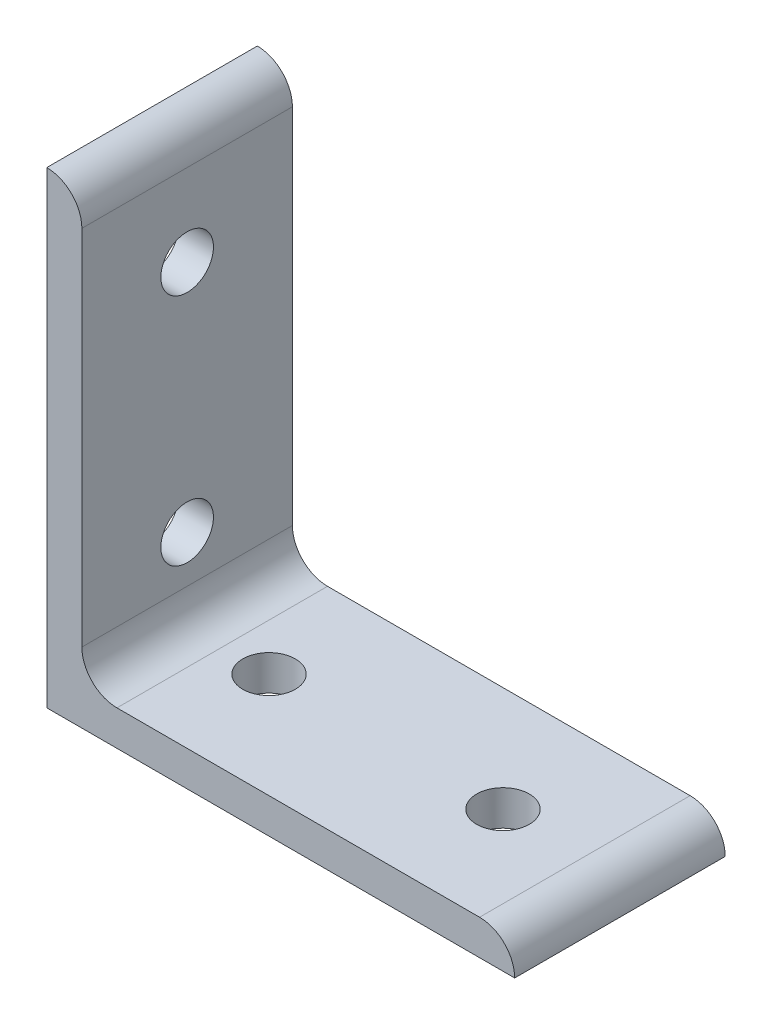
ISO-10303-21;
HEADER;
FILE_DESCRIPTION(('STEP AP214'),'2;1');
FILE_NAME('part.step','',(''),(''),'','','');
FILE_SCHEMA(('AUTOMOTIVE_DESIGN { 1 0 10303 214 1 1 1 1 }'));
ENDSEC;
DATA;
#1=APPLICATION_CONTEXT('core data for automotive mechanical design processes');
#2=APPLICATION_PROTOCOL_DEFINITION('international standard','automotive_design',2000,#1);
#3=PRODUCT_CONTEXT('',#1,'mechanical');
#4=PRODUCT('Part','Part','',(#3));
#5=PRODUCT_RELATED_PRODUCT_CATEGORY('part','',(#4));
#6=PRODUCT_DEFINITION_FORMATION('','',#4);
#7=PRODUCT_DEFINITION_CONTEXT('part definition',#1,'design');
#8=PRODUCT_DEFINITION('design','',#6,#7);
#9=PRODUCT_DEFINITION_SHAPE('','',#8);
#10=(LENGTH_UNIT() NAMED_UNIT(*) SI_UNIT(.MILLI.,.METRE.));
#11=(NAMED_UNIT(*) PLANE_ANGLE_UNIT() SI_UNIT($,.RADIAN.));
#12=(NAMED_UNIT(*) SI_UNIT($,.STERADIAN.) SOLID_ANGLE_UNIT());
#13=UNCERTAINTY_MEASURE_WITH_UNIT(LENGTH_MEASURE(1.E-05),#10,'distance_accuracy_value','');
#14=(GEOMETRIC_REPRESENTATION_CONTEXT(3) GLOBAL_UNCERTAINTY_ASSIGNED_CONTEXT((#13)) GLOBAL_UNIT_ASSIGNED_CONTEXT((#10,
#11,#12)) REPRESENTATION_CONTEXT('',''));
#15=CARTESIAN_POINT('',(0.,0.,0.));
#16=DIRECTION('',(0.,0.,1.));
#17=DIRECTION('',(1.,0.,0.));
#18=AXIS2_PLACEMENT_3D('',#15,#16,#17);
#19=CARTESIAN_POINT('',(5.99999999999999,74.,18.));
#20=DIRECTION('',(-1.,0.,0.));
#21=DIRECTION('',(0.,-1.,0.));
#22=AXIS2_PLACEMENT_3D('',#19,#20,#21);
#23=PLANE('',#22);
#24=CARTESIAN_POINT('',(6.00000000000001,20.,0.));
#25=DIRECTION('',(-1.,0.,0.));
#26=DIRECTION('',(0.,-1.,0.));
#27=AXIS2_PLACEMENT_3D('',#24,#25,#26);
#28=CIRCLE('',#27,4.5);
#29=CARTESIAN_POINT('',(6.00000000000001,15.5,0.));
#30=VERTEX_POINT('',#29);
#31=EDGE_CURVE('E199',#30,#30,#28,.F.);
#32=ORIENTED_EDGE('',*,*,#31,.F.);
#33=EDGE_LOOP('',(#32));
#34=FACE_BOUND('',#33,.T.);
#35=DIRECTION('',(0.,1.,0.));
#36=VECTOR('',#35,1.);
#37=CARTESIAN_POINT('',(5.99999999999999,74.,-18.));
#38=LINE('',#37,#36);
#39=CARTESIAN_POINT('',(6.,12.,-18.));
#40=VERTEX_POINT('',#39);
#41=CARTESIAN_POINT('',(6.00000000000001,74.,-18.));
#42=VERTEX_POINT('',#41);
#43=EDGE_CURVE('E120',#40,#42,#38,.T.);
#44=ORIENTED_EDGE('',*,*,#43,.T.);
#45=DIRECTION('',(0.,0.,-1.));
#46=VECTOR('',#45,1.);
#47=CARTESIAN_POINT('',(6.00000000000001,74.,18.));
#48=LINE('',#47,#46);
#49=CARTESIAN_POINT('',(6.00000000000001,74.,18.));
#50=VERTEX_POINT('',#49);
#51=EDGE_CURVE('E117',#50,#42,#48,.T.);
#52=ORIENTED_EDGE('',*,*,#51,.F.);
#53=DIRECTION('',(0.,1.,0.));
#54=VECTOR('',#53,1.);
#55=CARTESIAN_POINT('',(5.99999999999999,74.,18.));
#56=LINE('',#55,#54);
#57=CARTESIAN_POINT('',(6.,12.,18.));
#58=VERTEX_POINT('',#57);
#59=EDGE_CURVE('E106',#58,#50,#56,.T.);
#60=ORIENTED_EDGE('',*,*,#59,.F.);
#61=DIRECTION('',(0.,0.,-1.));
#62=VECTOR('',#61,1.);
#63=CARTESIAN_POINT('',(6.,12.,18.));
#64=LINE('',#63,#62);
#65=EDGE_CURVE('E121',#58,#40,#64,.T.);
#66=ORIENTED_EDGE('',*,*,#65,.T.);
#67=EDGE_LOOP('',(#44,#52,#60,#66));
#68=FACE_BOUND('',#67,.T.);
#69=CARTESIAN_POINT('',(5.99999999999999,60.,0.));
#70=DIRECTION('',(-1.,0.,0.));
#71=DIRECTION('',(0.,-1.,0.));
#72=AXIS2_PLACEMENT_3D('',#69,#70,#71);
#73=CIRCLE('',#72,4.5);
#74=CARTESIAN_POINT('',(5.99999999999999,55.5,0.));
#75=VERTEX_POINT('',#74);
#76=EDGE_CURVE('E192',#75,#75,#73,.F.);
#77=ORIENTED_EDGE('',*,*,#76,.F.);
#78=EDGE_LOOP('',(#77));
#79=FACE_BOUND('',#78,.T.);
#80=ADVANCED_FACE('F37',(#34,#68,#79),#23,.F.);
#81=CARTESIAN_POINT('',(0.,0.,18.));
#82=DIRECTION('',(1.,0.,0.));
#83=DIRECTION('',(0.,0.,-1.));
#84=AXIS2_PLACEMENT_3D('',#81,#82,#83);
#85=PLANE('',#84);
#86=CARTESIAN_POINT('',(0.,20.,0.));
#87=DIRECTION('',(1.,0.,0.));
#88=DIRECTION('',(0.,0.,-1.));
#89=AXIS2_PLACEMENT_3D('',#86,#87,#88);
#90=CIRCLE('',#89,4.5);
#91=CARTESIAN_POINT('',(0.,20.,-4.5));
#92=VERTEX_POINT('',#91);
#93=EDGE_CURVE('E195',#92,#92,#90,.T.);
#94=ORIENTED_EDGE('',*,*,#93,.T.);
#95=EDGE_LOOP('',(#94));
#96=FACE_BOUND('',#95,.T.);
#97=DIRECTION('',(0.,-1.,0.));
#98=VECTOR('',#97,1.);
#99=CARTESIAN_POINT('',(0.,0.,-18.));
#100=LINE('',#99,#98);
#101=CARTESIAN_POINT('',(0.,80.,-18.));
#102=VERTEX_POINT('',#101);
#103=CARTESIAN_POINT('',(0.,0.,-18.));
#104=VERTEX_POINT('',#103);
#105=EDGE_CURVE('E88',#102,#104,#100,.T.);
#106=ORIENTED_EDGE('',*,*,#105,.T.);
#107=DIRECTION('',(0.,0.,-1.));
#108=VECTOR('',#107,1.);
#109=CARTESIAN_POINT('',(0.,0.,18.));
#110=LINE('',#109,#108);
#111=CARTESIAN_POINT('',(0.,0.,18.));
#112=VERTEX_POINT('',#111);
#113=EDGE_CURVE('E126',#112,#104,#110,.T.);
#114=ORIENTED_EDGE('',*,*,#113,.F.);
#115=DIRECTION('',(0.,-1.,0.));
#116=VECTOR('',#115,1.);
#117=CARTESIAN_POINT('',(0.,0.,18.));
#118=LINE('',#117,#116);
#119=CARTESIAN_POINT('',(0.,80.,18.));
#120=VERTEX_POINT('',#119);
#121=EDGE_CURVE('E56',#120,#112,#118,.T.);
#122=ORIENTED_EDGE('',*,*,#121,.F.);
#123=DIRECTION('',(0.,0.,-1.));
#124=VECTOR('',#123,1.);
#125=CARTESIAN_POINT('',(0.,80.,18.));
#126=LINE('',#125,#124);
#127=EDGE_CURVE('E122',#120,#102,#126,.T.);
#128=ORIENTED_EDGE('',*,*,#127,.T.);
#129=EDGE_LOOP('',(#106,#114,#122,#128));
#130=FACE_BOUND('',#129,.T.);
#131=CARTESIAN_POINT('',(0.,60.,0.));
#132=DIRECTION('',(1.,0.,0.));
#133=DIRECTION('',(0.,0.,-1.));
#134=AXIS2_PLACEMENT_3D('',#131,#132,#133);
#135=CIRCLE('',#134,4.5);
#136=CARTESIAN_POINT('',(0.,60.,-4.5));
#137=VERTEX_POINT('',#136);
#138=EDGE_CURVE('E190',#137,#137,#135,.T.);
#139=ORIENTED_EDGE('',*,*,#138,.T.);
#140=EDGE_LOOP('',(#139));
#141=FACE_BOUND('',#140,.T.);
#142=ADVANCED_FACE('F183',(#96,#130,#141),#85,.F.);
#143=CARTESIAN_POINT('',(80.,0.,18.));
#144=DIRECTION('',(0.,1.,0.));
#145=DIRECTION('',(-1.,0.,0.));
#146=AXIS2_PLACEMENT_3D('',#143,#144,#145);
#147=PLANE('',#146);
#148=CARTESIAN_POINT('',(20.,0.,0.));
#149=DIRECTION('',(0.,1.,0.));
#150=DIRECTION('',(0.,0.,1.));
#151=AXIS2_PLACEMENT_3D('',#148,#149,#150);
#152=CIRCLE('',#151,4.5);
#153=CARTESIAN_POINT('',(20.,0.,4.5));
#154=VERTEX_POINT('',#153);
#155=EDGE_CURVE('E152',#154,#154,#152,.T.);
#156=ORIENTED_EDGE('',*,*,#155,.T.);
#157=EDGE_LOOP('',(#156));
#158=FACE_BOUND('',#157,.T.);
#159=DIRECTION('',(1.,0.,0.));
#160=VECTOR('',#159,1.);
#161=CARTESIAN_POINT('',(80.,0.,-18.));
#162=LINE('',#161,#160);
#163=CARTESIAN_POINT('',(80.,0.,-18.));
#164=VERTEX_POINT('',#163);
#165=EDGE_CURVE('E130',#104,#164,#162,.T.);
#166=ORIENTED_EDGE('',*,*,#165,.T.);
#167=DIRECTION('',(0.,0.,-1.));
#168=VECTOR('',#167,1.);
#169=CARTESIAN_POINT('',(80.,0.,18.));
#170=LINE('',#169,#168);
#171=CARTESIAN_POINT('',(80.,0.,18.));
#172=VERTEX_POINT('',#171);
#173=EDGE_CURVE('E11',#172,#164,#170,.T.);
#174=ORIENTED_EDGE('',*,*,#173,.F.);
#175=DIRECTION('',(1.,0.,0.));
#176=VECTOR('',#175,1.);
#177=CARTESIAN_POINT('',(80.,0.,18.));
#178=LINE('',#177,#176);
#179=EDGE_CURVE('E143',#112,#172,#178,.T.);
#180=ORIENTED_EDGE('',*,*,#179,.F.);
#181=ORIENTED_EDGE('',*,*,#113,.T.);
#182=EDGE_LOOP('',(#166,#174,#180,#181));
#183=FACE_BOUND('',#182,.T.);
#184=CARTESIAN_POINT('',(60.,0.,0.));
#185=DIRECTION('',(0.,1.,0.));
#186=DIRECTION('',(0.,0.,1.));
#187=AXIS2_PLACEMENT_3D('',#184,#185,#186);
#188=CIRCLE('',#187,4.5);
#189=CARTESIAN_POINT('',(60.,0.,4.5));
#190=VERTEX_POINT('',#189);
#191=EDGE_CURVE('E160',#190,#190,#188,.T.);
#192=ORIENTED_EDGE('',*,*,#191,.T.);
#193=EDGE_LOOP('',(#192));
#194=FACE_BOUND('',#193,.T.);
#195=ADVANCED_FACE('F39',(#158,#183,#194),#147,.F.);
#196=CARTESIAN_POINT('',(12.,6.00000000000001,18.));
#197=DIRECTION('',(0.,-1.,0.));
#198=DIRECTION('',(1.,0.,0.));
#199=AXIS2_PLACEMENT_3D('',#196,#197,#198);
#200=PLANE('',#199);
#201=CARTESIAN_POINT('',(20.,6.00000000000001,0.));
#202=DIRECTION('',(0.,-1.,0.));
#203=DIRECTION('',(1.,0.,0.));
#204=AXIS2_PLACEMENT_3D('',#201,#202,#203);
#205=CIRCLE('',#204,4.5);
#206=CARTESIAN_POINT('',(24.5,6.00000000000001,0.));
#207=VERTEX_POINT('',#206);
#208=EDGE_CURVE('E134',#207,#207,#205,.F.);
#209=ORIENTED_EDGE('',*,*,#208,.F.);
#210=EDGE_LOOP('',(#209));
#211=FACE_BOUND('',#210,.T.);
#212=DIRECTION('',(-1.,0.,0.));
#213=VECTOR('',#212,1.);
#214=CARTESIAN_POINT('',(12.,6.00000000000001,-18.));
#215=LINE('',#214,#213);
#216=CARTESIAN_POINT('',(74.,6.,-18.));
#217=VERTEX_POINT('',#216);
#218=CARTESIAN_POINT('',(12.,6.00000000000001,-18.));
#219=VERTEX_POINT('',#218);
#220=EDGE_CURVE('E136',#217,#219,#215,.T.);
#221=ORIENTED_EDGE('',*,*,#220,.T.);
#222=DIRECTION('',(0.,0.,-1.));
#223=VECTOR('',#222,1.);
#224=CARTESIAN_POINT('',(12.,6.00000000000001,18.));
#225=LINE('',#224,#223);
#226=CARTESIAN_POINT('',(12.,6.00000000000001,18.));
#227=VERTEX_POINT('',#226);
#228=EDGE_CURVE('E147',#227,#219,#225,.T.);
#229=ORIENTED_EDGE('',*,*,#228,.F.);
#230=DIRECTION('',(-1.,0.,0.));
#231=VECTOR('',#230,1.);
#232=CARTESIAN_POINT('',(12.,6.00000000000001,18.));
#233=LINE('',#232,#231);
#234=CARTESIAN_POINT('',(74.,6.,18.));
#235=VERTEX_POINT('',#234);
#236=EDGE_CURVE('E166',#235,#227,#233,.T.);
#237=ORIENTED_EDGE('',*,*,#236,.F.);
#238=DIRECTION('',(0.,0.,-1.));
#239=VECTOR('',#238,1.);
#240=CARTESIAN_POINT('',(74.,6.,18.));
#241=LINE('',#240,#239);
#242=EDGE_CURVE('E47',#235,#217,#241,.T.);
#243=ORIENTED_EDGE('',*,*,#242,.T.);
#244=EDGE_LOOP('',(#221,#229,#237,#243));
#245=FACE_BOUND('',#244,.T.);
#246=CARTESIAN_POINT('',(60.,6.00000000000001,0.));
#247=DIRECTION('',(0.,-1.,0.));
#248=DIRECTION('',(1.,0.,0.));
#249=AXIS2_PLACEMENT_3D('',#246,#247,#248);
#250=CIRCLE('',#249,4.5);
#251=CARTESIAN_POINT('',(64.5,6.00000000000001,0.));
#252=VERTEX_POINT('',#251);
#253=EDGE_CURVE('E41',#252,#252,#250,.F.);
#254=ORIENTED_EDGE('',*,*,#253,.F.);
#255=EDGE_LOOP('',(#254));
#256=FACE_BOUND('',#255,.T.);
#257=ADVANCED_FACE('F170',(#211,#245,#256),#200,.F.);
#258=CARTESIAN_POINT('',(74.,0.,18.));
#259=DIRECTION('',(0.,0.,-1.));
#260=DIRECTION('',(-1.,0.,0.));
#261=AXIS2_PLACEMENT_3D('',#258,#259,#260);
#262=CYLINDRICAL_SURFACE('',#261,6.00000000000002);
#263=CARTESIAN_POINT('',(74.,0.,-18.));
#264=DIRECTION('',(0.,0.,1.));
#265=DIRECTION('',(1.,0.,0.));
#266=AXIS2_PLACEMENT_3D('',#263,#264,#265);
#267=CIRCLE('',#266,6.00000000000002);
#268=EDGE_CURVE('E133',#164,#217,#267,.T.);
#269=ORIENTED_EDGE('',*,*,#268,.T.);
#270=ORIENTED_EDGE('',*,*,#242,.F.);
#271=CARTESIAN_POINT('',(74.,0.,18.));
#272=DIRECTION('',(0.,0.,1.));
#273=DIRECTION('',(1.,0.,0.));
#274=AXIS2_PLACEMENT_3D('',#271,#272,#273);
#275=CIRCLE('',#274,6.00000000000002);
#276=EDGE_CURVE('E96',#172,#235,#275,.T.);
#277=ORIENTED_EDGE('',*,*,#276,.F.);
#278=ORIENTED_EDGE('',*,*,#173,.T.);
#279=EDGE_LOOP('',(#269,#270,#277,#278));
#280=FACE_BOUND('',#279,.T.);
#281=ADVANCED_FACE('F214',(#280),#262,.T.);
#282=CARTESIAN_POINT('',(12.,12.,18.));
#283=DIRECTION('',(0.,0.,-1.));
#284=DIRECTION('',(-1.,0.,0.));
#285=AXIS2_PLACEMENT_3D('',#282,#283,#284);
#286=CYLINDRICAL_SURFACE('',#285,6.);
#287=CARTESIAN_POINT('',(12.,12.,-18.));
#288=DIRECTION('',(0.,0.,-1.));
#289=DIRECTION('',(1.,0.,0.));
#290=AXIS2_PLACEMENT_3D('',#287,#288,#289);
#291=CIRCLE('',#290,6.);
#292=EDGE_CURVE('E138',#219,#40,#291,.T.);
#293=ORIENTED_EDGE('',*,*,#292,.T.);
#294=ORIENTED_EDGE('',*,*,#65,.F.);
#295=CARTESIAN_POINT('',(12.,12.,18.));
#296=DIRECTION('',(0.,0.,-1.));
#297=DIRECTION('',(1.,0.,0.));
#298=AXIS2_PLACEMENT_3D('',#295,#296,#297);
#299=CIRCLE('',#298,6.);
#300=EDGE_CURVE('E112',#227,#58,#299,.T.);
#301=ORIENTED_EDGE('',*,*,#300,.F.);
#302=ORIENTED_EDGE('',*,*,#228,.T.);
#303=EDGE_LOOP('',(#293,#294,#301,#302));
#304=FACE_BOUND('',#303,.T.);
#305=ADVANCED_FACE('F175',(#304),#286,.F.);
#306=CARTESIAN_POINT('',(0.,74.,18.));
#307=DIRECTION('',(0.,0.,-1.));
#308=DIRECTION('',(-1.,0.,0.));
#309=AXIS2_PLACEMENT_3D('',#306,#307,#308);
#310=CYLINDRICAL_SURFACE('',#309,6.00000000000002);
#311=CARTESIAN_POINT('',(0.,74.,-18.));
#312=DIRECTION('',(0.,0.,1.));
#313=DIRECTION('',(1.,0.,0.));
#314=AXIS2_PLACEMENT_3D('',#311,#312,#313);
#315=CIRCLE('',#314,6.00000000000002);
#316=EDGE_CURVE('E82',#42,#102,#315,.T.);
#317=ORIENTED_EDGE('',*,*,#316,.T.);
#318=ORIENTED_EDGE('',*,*,#127,.F.);
#319=CARTESIAN_POINT('',(0.,74.,18.));
#320=DIRECTION('',(0.,0.,1.));
#321=DIRECTION('',(1.,0.,0.));
#322=AXIS2_PLACEMENT_3D('',#319,#320,#321);
#323=CIRCLE('',#322,6.00000000000002);
#324=EDGE_CURVE('E110',#50,#120,#323,.T.);
#325=ORIENTED_EDGE('',*,*,#324,.F.);
#326=ORIENTED_EDGE('',*,*,#51,.T.);
#327=EDGE_LOOP('',(#317,#318,#325,#326));
#328=FACE_BOUND('',#327,.T.);
#329=ADVANCED_FACE('F124',(#328),#310,.T.);
#330=CARTESIAN_POINT('',(0.,74.,18.));
#331=DIRECTION('',(0.,0.,1.));
#332=DIRECTION('',(1.,0.,0.));
#333=AXIS2_PLACEMENT_3D('',#330,#331,#332);
#334=PLANE('',#333);
#335=ORIENTED_EDGE('',*,*,#179,.T.);
#336=ORIENTED_EDGE('',*,*,#276,.T.);
#337=ORIENTED_EDGE('',*,*,#236,.T.);
#338=ORIENTED_EDGE('',*,*,#300,.T.);
#339=ORIENTED_EDGE('',*,*,#59,.T.);
#340=ORIENTED_EDGE('',*,*,#324,.T.);
#341=ORIENTED_EDGE('',*,*,#121,.T.);
#342=EDGE_LOOP('',(#335,#336,#337,#338,#339,#340,#341));
#343=FACE_BOUND('',#342,.T.);
#344=ADVANCED_FACE('F108',(#343),#334,.T.);
#345=CARTESIAN_POINT('',(0.,74.,-18.));
#346=DIRECTION('',(0.,0.,1.));
#347=DIRECTION('',(1.,0.,0.));
#348=AXIS2_PLACEMENT_3D('',#345,#346,#347);
#349=PLANE('',#348);
#350=ORIENTED_EDGE('',*,*,#165,.F.);
#351=ORIENTED_EDGE('',*,*,#105,.F.);
#352=ORIENTED_EDGE('',*,*,#316,.F.);
#353=ORIENTED_EDGE('',*,*,#43,.F.);
#354=ORIENTED_EDGE('',*,*,#292,.F.);
#355=ORIENTED_EDGE('',*,*,#220,.F.);
#356=ORIENTED_EDGE('',*,*,#268,.F.);
#357=EDGE_LOOP('',(#350,#351,#352,#353,#354,#355,#356));
#358=FACE_BOUND('',#357,.T.);
#359=ADVANCED_FACE('F178',(#358),#349,.F.);
#360=CARTESIAN_POINT('',(20.,80.,0.));
#361=DIRECTION('',(0.,-1.,0.));
#362=DIRECTION('',(0.,0.,-1.));
#363=AXIS2_PLACEMENT_3D('',#360,#361,#362);
#364=CYLINDRICAL_SURFACE('',#363,4.5);
#365=ORIENTED_EDGE('',*,*,#155,.F.);
#366=EDGE_LOOP('',(#365));
#367=FACE_BOUND('',#366,.T.);
#368=ORIENTED_EDGE('',*,*,#208,.T.);
#369=EDGE_LOOP('',(#368));
#370=FACE_BOUND('',#369,.T.);
#371=ADVANCED_FACE('F210',(#367,#370),#364,.F.);
#372=CARTESIAN_POINT('',(60.,80.,0.));
#373=DIRECTION('',(0.,-1.,0.));
#374=DIRECTION('',(0.,0.,-1.));
#375=AXIS2_PLACEMENT_3D('',#372,#373,#374);
#376=CYLINDRICAL_SURFACE('',#375,4.5);
#377=ORIENTED_EDGE('',*,*,#191,.F.);
#378=EDGE_LOOP('',(#377));
#379=FACE_BOUND('',#378,.T.);
#380=ORIENTED_EDGE('',*,*,#253,.T.);
#381=EDGE_LOOP('',(#380));
#382=FACE_BOUND('',#381,.T.);
#383=ADVANCED_FACE('F206',(#379,#382),#376,.F.);
#384=CARTESIAN_POINT('',(80.,20.,0.));
#385=DIRECTION('',(-1.,0.,0.));
#386=DIRECTION('',(0.,0.,1.));
#387=AXIS2_PLACEMENT_3D('',#384,#385,#386);
#388=CYLINDRICAL_SURFACE('',#387,4.5);
#389=ORIENTED_EDGE('',*,*,#93,.F.);
#390=EDGE_LOOP('',(#389));
#391=FACE_BOUND('',#390,.T.);
#392=ORIENTED_EDGE('',*,*,#31,.T.);
#393=EDGE_LOOP('',(#392));
#394=FACE_BOUND('',#393,.T.);
#395=ADVANCED_FACE('F209',(#391,#394),#388,.F.);
#396=CARTESIAN_POINT('',(80.,60.,0.));
#397=DIRECTION('',(-1.,0.,0.));
#398=DIRECTION('',(0.,0.,1.));
#399=AXIS2_PLACEMENT_3D('',#396,#397,#398);
#400=CYLINDRICAL_SURFACE('',#399,4.5);
#401=ORIENTED_EDGE('',*,*,#138,.F.);
#402=EDGE_LOOP('',(#401));
#403=FACE_BOUND('',#402,.T.);
#404=ORIENTED_EDGE('',*,*,#76,.T.);
#405=EDGE_LOOP('',(#404));
#406=FACE_BOUND('',#405,.T.);
#407=ADVANCED_FACE('F246',(#403,#406),#400,.F.);
#408=CLOSED_SHELL('',(#80,#142,#195,#257,#281,#305,#329,#344,#359,#371,#383,#395,#407));
#409=MANIFOLD_SOLID_BREP('B2',#408);
#410=ADVANCED_BREP_SHAPE_REPRESENTATION('',(#18,#409),#14);
#411=SHAPE_DEFINITION_REPRESENTATION(#9,#410);
ENDSEC;
END-ISO-10303-21;
